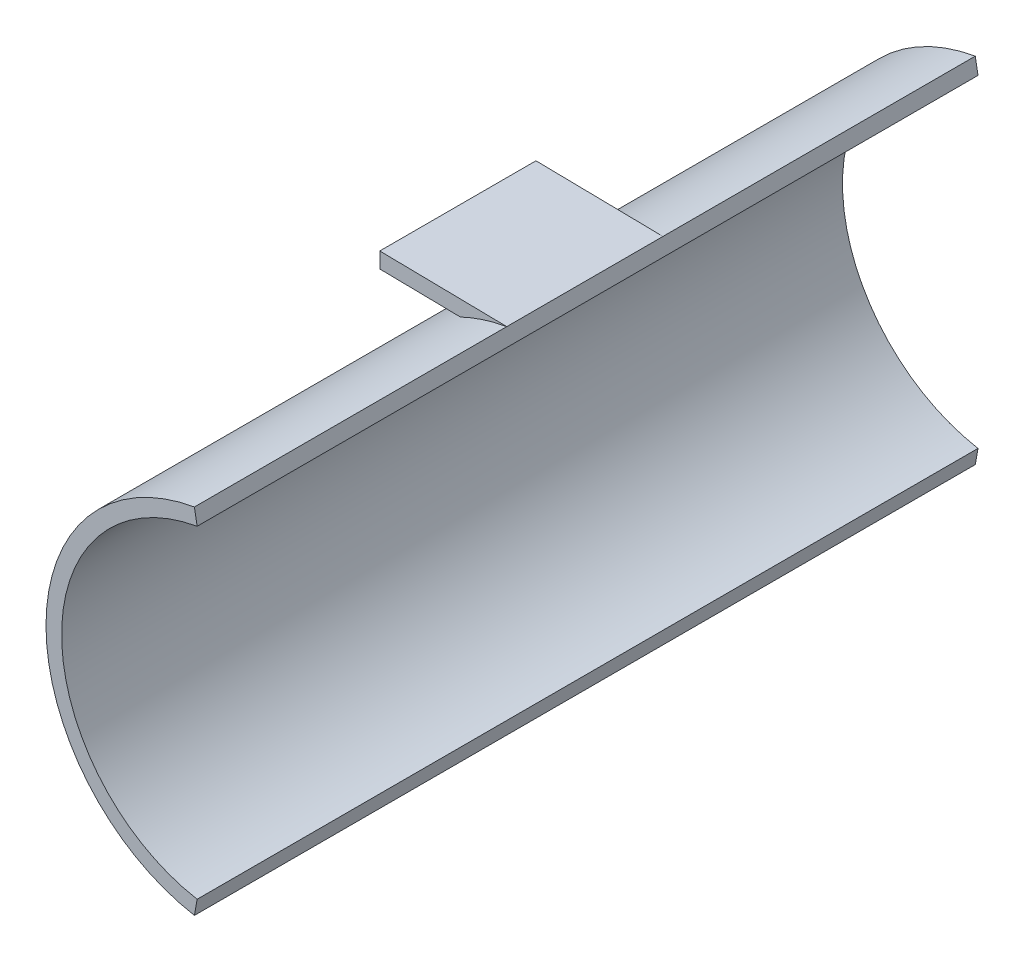
ISO-10303-21;
HEADER;
FILE_DESCRIPTION(('STEP AP214'),'2;1');
FILE_NAME('part.step','',(''),(''),'','','');
FILE_SCHEMA(('AUTOMOTIVE_DESIGN { 1 0 10303 214 1 1 1 1 }'));
ENDSEC;
DATA;
#1=APPLICATION_CONTEXT('core data for automotive mechanical design processes');
#2=APPLICATION_PROTOCOL_DEFINITION('international standard','automotive_design',2000,#1);
#3=PRODUCT_CONTEXT('',#1,'mechanical');
#4=PRODUCT('Part','Part','',(#3));
#5=PRODUCT_RELATED_PRODUCT_CATEGORY('part','',(#4));
#6=PRODUCT_DEFINITION_FORMATION('','',#4);
#7=PRODUCT_DEFINITION_CONTEXT('part definition',#1,'design');
#8=PRODUCT_DEFINITION('design','',#6,#7);
#9=PRODUCT_DEFINITION_SHAPE('','',#8);
#10=(LENGTH_UNIT() NAMED_UNIT(*) SI_UNIT(.MILLI.,.METRE.));
#11=(NAMED_UNIT(*) PLANE_ANGLE_UNIT() SI_UNIT($,.RADIAN.));
#12=(NAMED_UNIT(*) SI_UNIT($,.STERADIAN.) SOLID_ANGLE_UNIT());
#13=UNCERTAINTY_MEASURE_WITH_UNIT(LENGTH_MEASURE(1.E-05),#10,'distance_accuracy_value','');
#14=(GEOMETRIC_REPRESENTATION_CONTEXT(3) GLOBAL_UNCERTAINTY_ASSIGNED_CONTEXT((#13)) GLOBAL_UNIT_ASSIGNED_CONTEXT((#10,
#11,#12)) REPRESENTATION_CONTEXT('',''));
#15=CARTESIAN_POINT('',(0.,0.,0.));
#16=DIRECTION('',(0.,0.,1.));
#17=DIRECTION('',(1.,0.,0.));
#18=AXIS2_PLACEMENT_3D('',#15,#16,#17);
#19=CARTESIAN_POINT('',(0.,0.,50.));
#20=DIRECTION('',(0.,0.,-1.));
#21=DIRECTION('',(-1.,0.,0.));
#22=AXIS2_PLACEMENT_3D('',#19,#20,#21);
#23=CYLINDRICAL_SURFACE('',#22,21.);
#24=CARTESIAN_POINT('',(0.,0.,-50.));
#25=DIRECTION('',(0.,0.,-1.));
#26=DIRECTION('',(1.,0.,0.));
#27=AXIS2_PLACEMENT_3D('',#24,#25,#26);
#28=CIRCLE('',#27,21.);
#29=CARTESIAN_POINT('',(-3.6466117310054,-20.6809628132564,-50.));
#30=VERTEX_POINT('',#29);
#31=CARTESIAN_POINT('',(-3.6466117310054,20.6809628132564,-50.));
#32=VERTEX_POINT('',#31);
#33=EDGE_CURVE('E136',#30,#32,#28,.T.);
#34=ORIENTED_EDGE('',*,*,#33,.T.);
#35=DIRECTION('',(0.,0.,-1.));
#36=VECTOR('',#35,1.);
#37=CARTESIAN_POINT('',(-3.6466117310054,20.6809628132564,50.));
#38=LINE('',#37,#36);
#39=CARTESIAN_POINT('',(-3.6466117310054,20.6809628132564,50.));
#40=VERTEX_POINT('',#39);
#41=EDGE_CURVE('E11',#40,#32,#38,.T.);
#42=ORIENTED_EDGE('',*,*,#41,.F.);
#43=CARTESIAN_POINT('',(0.,0.,50.));
#44=DIRECTION('',(0.,0.,-1.));
#45=DIRECTION('',(1.,0.,0.));
#46=AXIS2_PLACEMENT_3D('',#43,#44,#45);
#47=CIRCLE('',#46,21.);
#48=CARTESIAN_POINT('',(-3.6466117310054,-20.6809628132564,50.));
#49=VERTEX_POINT('',#48);
#50=EDGE_CURVE('E137',#49,#40,#47,.T.);
#51=ORIENTED_EDGE('',*,*,#50,.F.);
#52=DIRECTION('',(0.,0.,-1.));
#53=VECTOR('',#52,1.);
#54=CARTESIAN_POINT('',(-3.6466117310054,-20.6809628132564,50.));
#55=LINE('',#54,#53);
#56=EDGE_CURVE('E147',#49,#30,#55,.T.);
#57=ORIENTED_EDGE('',*,*,#56,.T.);
#58=EDGE_LOOP('',(#34,#42,#51,#57));
#59=FACE_BOUND('',#58,.T.);
#60=ADVANCED_FACE('F35',(#59),#23,.F.);
#61=CARTESIAN_POINT('',(-3.6466117310054,20.6809628132564,50.));
#62=DIRECTION('',(-0.984807753012209,-0.173648177666924,0.));
#63=DIRECTION('',(0.173648177666924,-0.984807753012209,0.));
#64=AXIS2_PLACEMENT_3D('',#61,#62,#63);
#65=PLANE('',#64);
#66=DIRECTION('',(-0.173648177666924,0.984807753012209,0.));
#67=VECTOR('',#66,1.);
#68=CARTESIAN_POINT('',(-3.6466117310054,20.6809628132564,-50.));
#69=LINE('',#68,#67);
#70=CARTESIAN_POINT('',(-3.99390808633925,22.6505783192808,-50.));
#71=VERTEX_POINT('',#70);
#72=EDGE_CURVE('E150',#32,#71,#69,.T.);
#73=ORIENTED_EDGE('',*,*,#72,.T.);
#74=DIRECTION('',(0.,0.,-1.));
#75=VECTOR('',#74,1.);
#76=CARTESIAN_POINT('',(-3.99390808633925,22.6505783192808,50.));
#77=LINE('',#76,#75);
#78=CARTESIAN_POINT('',(-3.99390808633925,22.6505783192808,-10.));
#79=VERTEX_POINT('',#78);
#80=EDGE_CURVE('E160',#79,#71,#77,.T.);
#81=ORIENTED_EDGE('',*,*,#80,.F.);
#82=DIRECTION('',(0.,0.,-1.));
#83=VECTOR('',#82,1.);
#84=CARTESIAN_POINT('',(-3.99390808633925,22.6505783192808,10.));
#85=LINE('',#84,#83);
#86=CARTESIAN_POINT('',(-3.99390808633925,22.6505783192808,10.));
#87=VERTEX_POINT('',#86);
#88=EDGE_CURVE('E114',#87,#79,#85,.T.);
#89=ORIENTED_EDGE('',*,*,#88,.F.);
#90=CARTESIAN_POINT('',(-3.99390808633925,22.6505783192808,50.));
#91=VERTEX_POINT('',#90);
#92=EDGE_CURVE('E42',#91,#87,#77,.T.);
#93=ORIENTED_EDGE('',*,*,#92,.F.);
#94=DIRECTION('',(-0.173648177666924,0.984807753012209,0.));
#95=VECTOR('',#94,1.);
#96=CARTESIAN_POINT('',(-3.6466117310054,20.6809628132564,50.));
#97=LINE('',#96,#95);
#98=EDGE_CURVE('E140',#40,#91,#97,.T.);
#99=ORIENTED_EDGE('',*,*,#98,.F.);
#100=ORIENTED_EDGE('',*,*,#41,.T.);
#101=EDGE_LOOP('',(#73,#81,#89,#93,#99,#100));
#102=FACE_BOUND('',#101,.T.);
#103=ADVANCED_FACE('F167',(#102),#65,.F.);
#104=CARTESIAN_POINT('',(0.,0.,50.));
#105=DIRECTION('',(0.,0.,-1.));
#106=DIRECTION('',(-1.,0.,0.));
#107=AXIS2_PLACEMENT_3D('',#104,#105,#106);
#108=CYLINDRICAL_SURFACE('',#107,23.);
#109=ORIENTED_EDGE('',*,*,#92,.T.);
#110=CARTESIAN_POINT('',(0.,0.,10.));
#111=DIRECTION('',(0.,0.,-1.));
#112=DIRECTION('',(1.,0.,0.));
#113=AXIS2_PLACEMENT_3D('',#110,#111,#112);
#114=CIRCLE('',#113,23.);
#115=CARTESIAN_POINT('',(-9.93018463325344,20.7458774976981,9.99999999999999));
#116=VERTEX_POINT('',#115);
#117=EDGE_CURVE('E49',#116,#87,#114,.T.);
#118=ORIENTED_EDGE('',*,*,#117,.F.);
#119=DIRECTION('',(0.,0.,-1.));
#120=VECTOR('',#119,1.);
#121=CARTESIAN_POINT('',(-9.93018463325343,20.7458774976981,10.));
#122=LINE('',#121,#120);
#123=CARTESIAN_POINT('',(-9.93018463325343,20.7458774976981,-10.));
#124=VERTEX_POINT('',#123);
#125=EDGE_CURVE('E122',#116,#124,#122,.T.);
#126=ORIENTED_EDGE('',*,*,#125,.T.);
#127=CARTESIAN_POINT('',(0.,0.,-10.));
#128=DIRECTION('',(0.,0.,-1.));
#129=DIRECTION('',(1.,0.,0.));
#130=AXIS2_PLACEMENT_3D('',#127,#128,#129);
#131=CIRCLE('',#130,23.);
#132=EDGE_CURVE('E55',#124,#79,#131,.T.);
#133=ORIENTED_EDGE('',*,*,#132,.T.);
#134=ORIENTED_EDGE('',*,*,#80,.T.);
#135=CARTESIAN_POINT('',(0.,0.,-50.));
#136=DIRECTION('',(0.,0.,1.));
#137=DIRECTION('',(1.,0.,0.));
#138=AXIS2_PLACEMENT_3D('',#135,#136,#137);
#139=CIRCLE('',#138,23.);
#140=CARTESIAN_POINT('',(-3.99390808633925,-22.6505783192808,-50.));
#141=VERTEX_POINT('',#140);
#142=EDGE_CURVE('E153',#71,#141,#139,.T.);
#143=ORIENTED_EDGE('',*,*,#142,.T.);
#144=DIRECTION('',(0.,0.,-1.));
#145=VECTOR('',#144,1.);
#146=CARTESIAN_POINT('',(-3.99390808633925,-22.6505783192808,50.));
#147=LINE('',#146,#145);
#148=CARTESIAN_POINT('',(-3.99390808633925,-22.6505783192808,50.));
#149=VERTEX_POINT('',#148);
#150=EDGE_CURVE('E158',#149,#141,#147,.T.);
#151=ORIENTED_EDGE('',*,*,#150,.F.);
#152=CARTESIAN_POINT('',(0.,0.,50.));
#153=DIRECTION('',(0.,0.,1.));
#154=DIRECTION('',(1.,0.,0.));
#155=AXIS2_PLACEMENT_3D('',#152,#153,#154);
#156=CIRCLE('',#155,23.);
#157=EDGE_CURVE('E143',#91,#149,#156,.T.);
#158=ORIENTED_EDGE('',*,*,#157,.F.);
#159=EDGE_LOOP('',(#109,#118,#126,#133,#134,#143,#151,#158));
#160=FACE_BOUND('',#159,.T.);
#161=ADVANCED_FACE('F163',(#160),#108,.T.);
#162=CARTESIAN_POINT('',(-3.6466117310054,-20.6809628132564,50.));
#163=DIRECTION('',(-0.984807753012209,0.173648177666924,0.));
#164=DIRECTION('',(-0.173648177666924,-0.984807753012209,0.));
#165=AXIS2_PLACEMENT_3D('',#162,#163,#164);
#166=PLANE('',#165);
#167=DIRECTION('',(0.173648177666924,0.984807753012209,0.));
#168=VECTOR('',#167,1.);
#169=CARTESIAN_POINT('',(-3.6466117310054,-20.6809628132564,-50.));
#170=LINE('',#169,#168);
#171=EDGE_CURVE('E141',#141,#30,#170,.T.);
#172=ORIENTED_EDGE('',*,*,#171,.T.);
#173=ORIENTED_EDGE('',*,*,#56,.F.);
#174=DIRECTION('',(0.173648177666924,0.984807753012209,0.));
#175=VECTOR('',#174,1.);
#176=CARTESIAN_POINT('',(-3.6466117310054,-20.6809628132564,50.));
#177=LINE('',#176,#175);
#178=EDGE_CURVE('E145',#149,#49,#177,.T.);
#179=ORIENTED_EDGE('',*,*,#178,.F.);
#180=ORIENTED_EDGE('',*,*,#150,.T.);
#181=EDGE_LOOP('',(#172,#173,#179,#180));
#182=FACE_BOUND('',#181,.T.);
#183=ADVANCED_FACE('F175',(#182),#166,.F.);
#184=CARTESIAN_POINT('',(0.,0.,50.));
#185=DIRECTION('',(0.,0.,1.));
#186=DIRECTION('',(1.,0.,0.));
#187=AXIS2_PLACEMENT_3D('',#184,#185,#186);
#188=PLANE('',#187);
#189=ORIENTED_EDGE('',*,*,#50,.T.);
#190=ORIENTED_EDGE('',*,*,#98,.T.);
#191=ORIENTED_EDGE('',*,*,#157,.T.);
#192=ORIENTED_EDGE('',*,*,#178,.T.);
#193=EDGE_LOOP('',(#189,#190,#191,#192));
#194=FACE_BOUND('',#193,.T.);
#195=ADVANCED_FACE('F180',(#194),#188,.T.);
#196=CARTESIAN_POINT('',(0.,0.,-50.));
#197=DIRECTION('',(0.,0.,1.));
#198=DIRECTION('',(1.,0.,0.));
#199=AXIS2_PLACEMENT_3D('',#196,#197,#198);
#200=PLANE('',#199);
#201=ORIENTED_EDGE('',*,*,#33,.F.);
#202=ORIENTED_EDGE('',*,*,#171,.F.);
#203=ORIENTED_EDGE('',*,*,#142,.F.);
#204=ORIENTED_EDGE('',*,*,#72,.F.);
#205=EDGE_LOOP('',(#201,#202,#203,#204));
#206=FACE_BOUND('',#205,.T.);
#207=ADVANCED_FACE('F172',(#206),#200,.F.);
#208=CARTESIAN_POINT('',(-3.99390808633925,22.6505783192808,10.));
#209=DIRECTION('',(-0.016051627603669,-0.999871164326321,0.));
#210=DIRECTION('',(0.999871164326321,-0.016051627603669,0.));
#211=AXIS2_PLACEMENT_3D('',#208,#209,#210);
#212=PLANE('',#211);
#213=DIRECTION('',(-0.999871164326321,0.016051627603669,0.));
#214=VECTOR('',#213,1.);
#215=CARTESIAN_POINT('',(-3.99390808633925,22.6505783192808,-10.));
#216=LINE('',#215,#214);
#217=CARTESIAN_POINT('',(-20.2546713569423,22.9116236678053,-10.));
#218=VERTEX_POINT('',#217);
#219=EDGE_CURVE('E111',#79,#218,#216,.T.);
#220=ORIENTED_EDGE('',*,*,#219,.T.);
#221=DIRECTION('',(0.,0.,-1.));
#222=VECTOR('',#221,1.);
#223=CARTESIAN_POINT('',(-20.2546713569423,22.9116236678053,10.));
#224=LINE('',#223,#222);
#225=CARTESIAN_POINT('',(-20.2546713569423,22.9116236678053,10.));
#226=VERTEX_POINT('',#225);
#227=EDGE_CURVE('E108',#226,#218,#224,.T.);
#228=ORIENTED_EDGE('',*,*,#227,.F.);
#229=DIRECTION('',(-0.999871164326321,0.016051627603669,0.));
#230=VECTOR('',#229,1.);
#231=CARTESIAN_POINT('',(-3.99390808633925,22.6505783192808,10.));
#232=LINE('',#231,#230);
#233=EDGE_CURVE('E98',#87,#226,#232,.T.);
#234=ORIENTED_EDGE('',*,*,#233,.F.);
#235=ORIENTED_EDGE('',*,*,#88,.T.);
#236=EDGE_LOOP('',(#220,#228,#234,#235));
#237=FACE_BOUND('',#236,.T.);
#238=ADVANCED_FACE('F109',(#237),#212,.F.);
#239=CARTESIAN_POINT('',(-20.2546713569423,22.9116236678053,10.));
#240=DIRECTION('',(1.,0.,0.));
#241=DIRECTION('',(0.,0.,-1.));
#242=AXIS2_PLACEMENT_3D('',#239,#240,#241);
#243=PLANE('',#242);
#244=DIRECTION('',(0.,-1.,0.));
#245=VECTOR('',#244,1.);
#246=CARTESIAN_POINT('',(-20.2546713569423,22.9116236678053,-10.));
#247=LINE('',#246,#245);
#248=CARTESIAN_POINT('',(-20.2546713569423,20.9116236678053,-10.));
#249=VERTEX_POINT('',#248);
#250=EDGE_CURVE('E128',#218,#249,#247,.T.);
#251=ORIENTED_EDGE('',*,*,#250,.T.);
#252=DIRECTION('',(0.,0.,-1.));
#253=VECTOR('',#252,1.);
#254=CARTESIAN_POINT('',(-20.2546713569423,20.9116236678053,10.));
#255=LINE('',#254,#253);
#256=CARTESIAN_POINT('',(-20.2546713569423,20.9116236678053,10.));
#257=VERTEX_POINT('',#256);
#258=EDGE_CURVE('E115',#257,#249,#255,.T.);
#259=ORIENTED_EDGE('',*,*,#258,.F.);
#260=DIRECTION('',(0.,-1.,0.));
#261=VECTOR('',#260,1.);
#262=CARTESIAN_POINT('',(-20.2546713569423,22.9116236678053,10.));
#263=LINE('',#262,#261);
#264=EDGE_CURVE('E102',#226,#257,#263,.T.);
#265=ORIENTED_EDGE('',*,*,#264,.F.);
#266=ORIENTED_EDGE('',*,*,#227,.T.);
#267=EDGE_LOOP('',(#251,#259,#265,#266));
#268=FACE_BOUND('',#267,.T.);
#269=ADVANCED_FACE('F117',(#268),#243,.F.);
#270=CARTESIAN_POINT('',(-20.2546713569423,20.9116236678053,10.));
#271=DIRECTION('',(0.0160516276036691,0.999871164326321,0.));
#272=DIRECTION('',(-0.999871164326321,0.0160516276036691,0.));
#273=AXIS2_PLACEMENT_3D('',#270,#271,#272);
#274=PLANE('',#273);
#275=DIRECTION('',(0.999871164326321,-0.0160516276036691,0.));
#276=VECTOR('',#275,1.);
#277=CARTESIAN_POINT('',(-20.2546713569423,20.9116236678053,-10.));
#278=LINE('',#277,#276);
#279=EDGE_CURVE('E130',#249,#124,#278,.T.);
#280=ORIENTED_EDGE('',*,*,#279,.T.);
#281=ORIENTED_EDGE('',*,*,#125,.F.);
#282=DIRECTION('',(0.999871164326321,-0.0160516276036691,0.));
#283=VECTOR('',#282,1.);
#284=CARTESIAN_POINT('',(-20.2546713569423,20.9116236678053,10.));
#285=LINE('',#284,#283);
#286=EDGE_CURVE('E120',#257,#116,#285,.T.);
#287=ORIENTED_EDGE('',*,*,#286,.F.);
#288=ORIENTED_EDGE('',*,*,#258,.T.);
#289=EDGE_LOOP('',(#280,#281,#287,#288));
#290=FACE_BOUND('',#289,.T.);
#291=ADVANCED_FACE('F237',(#290),#274,.F.);
#292=CARTESIAN_POINT('',(0.,0.,10.));
#293=DIRECTION('',(0.,0.,1.));
#294=DIRECTION('',(1.,0.,0.));
#295=AXIS2_PLACEMENT_3D('',#292,#293,#294);
#296=PLANE('',#295);
#297=ORIENTED_EDGE('',*,*,#117,.T.);
#298=ORIENTED_EDGE('',*,*,#233,.T.);
#299=ORIENTED_EDGE('',*,*,#264,.T.);
#300=ORIENTED_EDGE('',*,*,#286,.T.);
#301=EDGE_LOOP('',(#297,#298,#299,#300));
#302=FACE_BOUND('',#301,.T.);
#303=ADVANCED_FACE('F100',(#302),#296,.T.);
#304=CARTESIAN_POINT('',(0.,0.,-10.));
#305=DIRECTION('',(0.,0.,1.));
#306=DIRECTION('',(1.,0.,0.));
#307=AXIS2_PLACEMENT_3D('',#304,#305,#306);
#308=PLANE('',#307);
#309=ORIENTED_EDGE('',*,*,#132,.F.);
#310=ORIENTED_EDGE('',*,*,#279,.F.);
#311=ORIENTED_EDGE('',*,*,#250,.F.);
#312=ORIENTED_EDGE('',*,*,#219,.F.);
#313=EDGE_LOOP('',(#309,#310,#311,#312));
#314=FACE_BOUND('',#313,.T.);
#315=ADVANCED_FACE('F251',(#314),#308,.F.);
#316=CLOSED_SHELL('',(#60,#103,#161,#183,#195,#207,#238,#269,#291,#303,#315));
#317=MANIFOLD_SOLID_BREP('B2',#316);
#318=ADVANCED_BREP_SHAPE_REPRESENTATION('',(#18,#317),#14);
#319=SHAPE_DEFINITION_REPRESENTATION(#9,#318);
ENDSEC;
END-ISO-10303-21;
